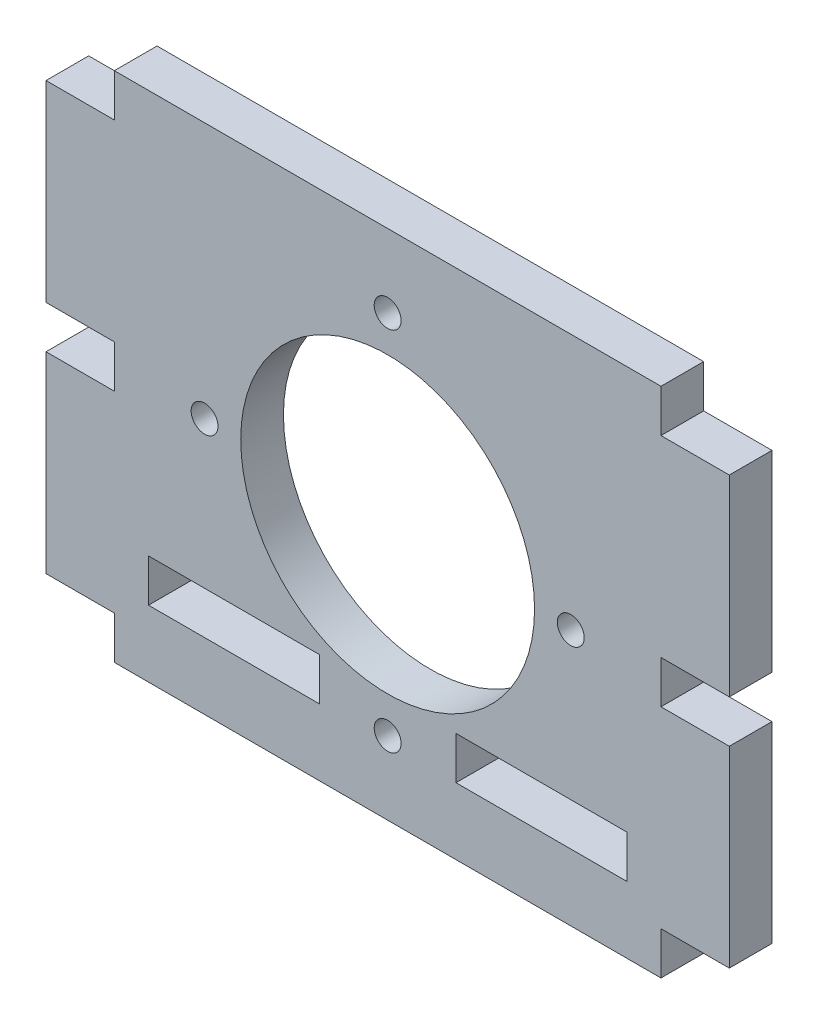
ISO-10303-21;
HEADER;
FILE_DESCRIPTION(('STEP AP214'),'2;1');
FILE_NAME('part.step','',(''),(''),'','','');
FILE_SCHEMA(('AUTOMOTIVE_DESIGN { 1 0 10303 214 1 1 1 1 }'));
ENDSEC;
DATA;
#1=APPLICATION_CONTEXT('core data for automotive mechanical design processes');
#2=APPLICATION_PROTOCOL_DEFINITION('international standard','automotive_design',2000,#1);
#3=PRODUCT_CONTEXT('',#1,'mechanical');
#4=PRODUCT('Part','Part','',(#3));
#5=PRODUCT_RELATED_PRODUCT_CATEGORY('part','',(#4));
#6=PRODUCT_DEFINITION_FORMATION('','',#4);
#7=PRODUCT_DEFINITION_CONTEXT('part definition',#1,'design');
#8=PRODUCT_DEFINITION('design','',#6,#7);
#9=PRODUCT_DEFINITION_SHAPE('','',#8);
#10=(LENGTH_UNIT() NAMED_UNIT(*) SI_UNIT(.MILLI.,.METRE.));
#11=(NAMED_UNIT(*) PLANE_ANGLE_UNIT() SI_UNIT($,.RADIAN.));
#12=(NAMED_UNIT(*) SI_UNIT($,.STERADIAN.) SOLID_ANGLE_UNIT());
#13=UNCERTAINTY_MEASURE_WITH_UNIT(LENGTH_MEASURE(1.E-05),#10,'distance_accuracy_value','');
#14=(GEOMETRIC_REPRESENTATION_CONTEXT(3) GLOBAL_UNCERTAINTY_ASSIGNED_CONTEXT((#13)) GLOBAL_UNIT_ASSIGNED_CONTEXT((#10,
#11,#12)) REPRESENTATION_CONTEXT('',''));
#15=CARTESIAN_POINT('',(0.,0.,0.));
#16=DIRECTION('',(0.,0.,1.));
#17=DIRECTION('',(1.,0.,0.));
#18=AXIS2_PLACEMENT_3D('',#15,#16,#17);
#19=CARTESIAN_POINT('',(-5.08000000000001,0.,3.175));
#20=DIRECTION('',(-1.,0.,0.));
#21=DIRECTION('',(0.,-1.,0.));
#22=AXIS2_PLACEMENT_3D('',#19,#20,#21);
#23=PLANE('',#22);
#24=DIRECTION('',(0.,1.,0.));
#25=VECTOR('',#24,1.);
#26=CARTESIAN_POINT('',(-5.08000000000001,0.,0.));
#27=LINE('',#26,#25);
#28=CARTESIAN_POINT('',(-5.08000000000001,-14.097,0.));
#29=VERTEX_POINT('',#28);
#30=CARTESIAN_POINT('',(-5.08000000000001,-10.922,0.));
#31=VERTEX_POINT('',#30);
#32=EDGE_CURVE('E407',#29,#31,#27,.T.);
#33=ORIENTED_EDGE('',*,*,#32,.F.);
#34=DIRECTION('',(0.,0.,-1.));
#35=VECTOR('',#34,1.);
#36=CARTESIAN_POINT('',(-5.08000000000001,-14.097,3.175));
#37=LINE('',#36,#35);
#38=CARTESIAN_POINT('',(-5.08000000000001,-14.097,3.175));
#39=VERTEX_POINT('',#38);
#40=EDGE_CURVE('E11',#39,#29,#37,.T.);
#41=ORIENTED_EDGE('',*,*,#40,.F.);
#42=DIRECTION('',(0.,1.,0.));
#43=VECTOR('',#42,1.);
#44=CARTESIAN_POINT('',(-5.08000000000001,0.,3.175));
#45=LINE('',#44,#43);
#46=CARTESIAN_POINT('',(-5.08000000000001,-10.922,3.175));
#47=VERTEX_POINT('',#46);
#48=EDGE_CURVE('E248',#39,#47,#45,.T.);
#49=ORIENTED_EDGE('',*,*,#48,.T.);
#50=DIRECTION('',(0.,0.,-1.));
#51=VECTOR('',#50,1.);
#52=CARTESIAN_POINT('',(-5.08000000000001,-10.922,3.175));
#53=LINE('',#52,#51);
#54=EDGE_CURVE('E61',#47,#31,#53,.T.);
#55=ORIENTED_EDGE('',*,*,#54,.T.);
#56=EDGE_LOOP('',(#33,#41,#49,#55));
#57=FACE_BOUND('',#56,.T.);
#58=ADVANCED_FACE('F41',(#57),#23,.T.);
#59=CARTESIAN_POINT('',(0.,-14.097,3.175));
#60=DIRECTION('',(0.,-1.,0.));
#61=DIRECTION('',(1.,0.,0.));
#62=AXIS2_PLACEMENT_3D('',#59,#60,#61);
#63=PLANE('',#62);
#64=DIRECTION('',(-1.,0.,0.));
#65=VECTOR('',#64,1.);
#66=CARTESIAN_POINT('',(0.,-14.097,0.));
#67=LINE('',#66,#65);
#68=CARTESIAN_POINT('',(-17.78,-14.097,0.));
#69=VERTEX_POINT('',#68);
#70=EDGE_CURVE('E254',#29,#69,#67,.T.);
#71=ORIENTED_EDGE('',*,*,#70,.T.);
#72=DIRECTION('',(0.,0.,-1.));
#73=VECTOR('',#72,1.);
#74=CARTESIAN_POINT('',(-17.78,-14.097,3.175));
#75=LINE('',#74,#73);
#76=CARTESIAN_POINT('',(-17.78,-14.097,3.175));
#77=VERTEX_POINT('',#76);
#78=EDGE_CURVE('E52',#77,#69,#75,.T.);
#79=ORIENTED_EDGE('',*,*,#78,.F.);
#80=DIRECTION('',(-1.,0.,0.));
#81=VECTOR('',#80,1.);
#82=CARTESIAN_POINT('',(0.,-14.097,3.175));
#83=LINE('',#82,#81);
#84=EDGE_CURVE('E243',#39,#77,#83,.T.);
#85=ORIENTED_EDGE('',*,*,#84,.F.);
#86=ORIENTED_EDGE('',*,*,#40,.T.);
#87=EDGE_LOOP('',(#71,#79,#85,#86));
#88=FACE_BOUND('',#87,.T.);
#89=ADVANCED_FACE('F252',(#88),#63,.F.);
#90=CARTESIAN_POINT('',(-17.78,0.,3.175));
#91=DIRECTION('',(-1.,0.,0.));
#92=DIRECTION('',(0.,0.,1.));
#93=AXIS2_PLACEMENT_3D('',#90,#91,#92);
#94=PLANE('',#93);
#95=DIRECTION('',(0.,1.,0.));
#96=VECTOR('',#95,1.);
#97=CARTESIAN_POINT('',(-17.78,0.,0.));
#98=LINE('',#97,#96);
#99=CARTESIAN_POINT('',(-17.78,-10.922,0.));
#100=VERTEX_POINT('',#99);
#101=EDGE_CURVE('E412',#69,#100,#98,.T.);
#102=ORIENTED_EDGE('',*,*,#101,.T.);
#103=DIRECTION('',(0.,0.,-1.));
#104=VECTOR('',#103,1.);
#105=CARTESIAN_POINT('',(-17.78,-10.922,3.175));
#106=LINE('',#105,#104);
#107=CARTESIAN_POINT('',(-17.78,-10.922,3.175));
#108=VERTEX_POINT('',#107);
#109=EDGE_CURVE('E147',#108,#100,#106,.T.);
#110=ORIENTED_EDGE('',*,*,#109,.F.);
#111=DIRECTION('',(0.,1.,0.));
#112=VECTOR('',#111,1.);
#113=CARTESIAN_POINT('',(-17.78,0.,3.175));
#114=LINE('',#113,#112);
#115=EDGE_CURVE('E234',#77,#108,#114,.T.);
#116=ORIENTED_EDGE('',*,*,#115,.F.);
#117=ORIENTED_EDGE('',*,*,#78,.T.);
#118=EDGE_LOOP('',(#102,#110,#116,#117));
#119=FACE_BOUND('',#118,.T.);
#120=ADVANCED_FACE('F236',(#119),#94,.F.);
#121=CARTESIAN_POINT('',(17.78,0.,3.175));
#122=DIRECTION('',(-1.,0.,0.));
#123=DIRECTION('',(0.,0.,1.));
#124=AXIS2_PLACEMENT_3D('',#121,#122,#123);
#125=PLANE('',#124);
#126=DIRECTION('',(0.,1.,0.));
#127=VECTOR('',#126,1.);
#128=CARTESIAN_POINT('',(17.78,0.,0.));
#129=LINE('',#128,#127);
#130=CARTESIAN_POINT('',(17.78,-14.097,0.));
#131=VERTEX_POINT('',#130);
#132=CARTESIAN_POINT('',(17.78,-10.922,0.));
#133=VERTEX_POINT('',#132);
#134=EDGE_CURVE('E391',#131,#133,#129,.T.);
#135=ORIENTED_EDGE('',*,*,#134,.F.);
#136=DIRECTION('',(0.,0.,-1.));
#137=VECTOR('',#136,1.);
#138=CARTESIAN_POINT('',(17.78,-14.097,3.175));
#139=LINE('',#138,#137);
#140=CARTESIAN_POINT('',(17.78,-14.097,3.175));
#141=VERTEX_POINT('',#140);
#142=EDGE_CURVE('E271',#141,#131,#139,.T.);
#143=ORIENTED_EDGE('',*,*,#142,.F.);
#144=DIRECTION('',(0.,1.,0.));
#145=VECTOR('',#144,1.);
#146=CARTESIAN_POINT('',(17.78,0.,3.175));
#147=LINE('',#146,#145);
#148=CARTESIAN_POINT('',(17.78,-10.922,3.175));
#149=VERTEX_POINT('',#148);
#150=EDGE_CURVE('E510',#141,#149,#147,.T.);
#151=ORIENTED_EDGE('',*,*,#150,.T.);
#152=DIRECTION('',(0.,0.,-1.));
#153=VECTOR('',#152,1.);
#154=CARTESIAN_POINT('',(17.78,-10.922,3.175));
#155=LINE('',#154,#153);
#156=EDGE_CURVE('E261',#149,#133,#155,.T.);
#157=ORIENTED_EDGE('',*,*,#156,.T.);
#158=EDGE_LOOP('',(#135,#143,#151,#157));
#159=FACE_BOUND('',#158,.T.);
#160=ADVANCED_FACE('F586',(#159),#125,.T.);
#161=CARTESIAN_POINT('',(0.,-14.097,3.175));
#162=DIRECTION('',(0.,1.,0.));
#163=DIRECTION('',(0.,0.,1.));
#164=AXIS2_PLACEMENT_3D('',#161,#162,#163);
#165=PLANE('',#164);
#166=DIRECTION('',(1.,0.,0.));
#167=VECTOR('',#166,1.);
#168=CARTESIAN_POINT('',(0.,-14.097,0.));
#169=LINE('',#168,#167);
#170=CARTESIAN_POINT('',(5.08000000000002,-14.097,0.));
#171=VERTEX_POINT('',#170);
#172=EDGE_CURVE('E395',#171,#131,#169,.T.);
#173=ORIENTED_EDGE('',*,*,#172,.F.);
#174=DIRECTION('',(0.,0.,-1.));
#175=VECTOR('',#174,1.);
#176=CARTESIAN_POINT('',(5.08000000000002,-14.097,3.175));
#177=LINE('',#176,#175);
#178=CARTESIAN_POINT('',(5.08000000000002,-14.097,3.175));
#179=VERTEX_POINT('',#178);
#180=EDGE_CURVE('E268',#179,#171,#177,.T.);
#181=ORIENTED_EDGE('',*,*,#180,.F.);
#182=DIRECTION('',(1.,0.,0.));
#183=VECTOR('',#182,1.);
#184=CARTESIAN_POINT('',(0.,-14.097,3.175));
#185=LINE('',#184,#183);
#186=EDGE_CURVE('E514',#179,#141,#185,.T.);
#187=ORIENTED_EDGE('',*,*,#186,.T.);
#188=ORIENTED_EDGE('',*,*,#142,.T.);
#189=EDGE_LOOP('',(#173,#181,#187,#188));
#190=FACE_BOUND('',#189,.T.);
#191=ADVANCED_FACE('F582',(#190),#165,.T.);
#192=CARTESIAN_POINT('',(5.08000000000002,0.,3.175));
#193=DIRECTION('',(-1.,0.,0.));
#194=DIRECTION('',(0.,0.,1.));
#195=AXIS2_PLACEMENT_3D('',#192,#193,#194);
#196=PLANE('',#195);
#197=DIRECTION('',(0.,1.,0.));
#198=VECTOR('',#197,1.);
#199=CARTESIAN_POINT('',(5.08000000000002,0.,0.));
#200=LINE('',#199,#198);
#201=CARTESIAN_POINT('',(5.08000000000002,-10.922,0.));
#202=VERTEX_POINT('',#201);
#203=EDGE_CURVE('E399',#171,#202,#200,.T.);
#204=ORIENTED_EDGE('',*,*,#203,.T.);
#205=DIRECTION('',(0.,0.,-1.));
#206=VECTOR('',#205,1.);
#207=CARTESIAN_POINT('',(5.08000000000002,-10.922,3.175));
#208=LINE('',#207,#206);
#209=CARTESIAN_POINT('',(5.08000000000002,-10.922,3.175));
#210=VERTEX_POINT('',#209);
#211=EDGE_CURVE('E264',#210,#202,#208,.T.);
#212=ORIENTED_EDGE('',*,*,#211,.F.);
#213=DIRECTION('',(0.,1.,0.));
#214=VECTOR('',#213,1.);
#215=CARTESIAN_POINT('',(5.08000000000002,0.,3.175));
#216=LINE('',#215,#214);
#217=EDGE_CURVE('E518',#179,#210,#216,.T.);
#218=ORIENTED_EDGE('',*,*,#217,.F.);
#219=ORIENTED_EDGE('',*,*,#180,.T.);
#220=EDGE_LOOP('',(#204,#212,#218,#219));
#221=FACE_BOUND('',#220,.T.);
#222=ADVANCED_FACE('F579',(#221),#196,.F.);
#223=CARTESIAN_POINT('',(0.,-1.58750000000001,3.175));
#224=DIRECTION('',(0.,1.,0.));
#225=DIRECTION('',(-1.,0.,0.));
#226=AXIS2_PLACEMENT_3D('',#223,#224,#225);
#227=PLANE('',#226);
#228=DIRECTION('',(1.,0.,0.));
#229=VECTOR('',#228,1.);
#230=CARTESIAN_POINT('',(0.,-1.58750000000001,0.));
#231=LINE('',#230,#229);
#232=CARTESIAN_POINT('',(-25.4,-1.58750000000001,0.));
#233=VERTEX_POINT('',#232);
#234=CARTESIAN_POINT('',(-20.3200000000001,-1.58750000000001,0.));
#235=VERTEX_POINT('',#234);
#236=EDGE_CURVE('E349',#233,#235,#231,.T.);
#237=ORIENTED_EDGE('',*,*,#236,.F.);
#238=DIRECTION('',(0.,0.,-1.));
#239=VECTOR('',#238,1.);
#240=CARTESIAN_POINT('',(-25.4,-1.58750000000001,3.175));
#241=LINE('',#240,#239);
#242=CARTESIAN_POINT('',(-25.4,-1.58750000000001,3.175));
#243=VERTEX_POINT('',#242);
#244=EDGE_CURVE('E45',#243,#233,#241,.T.);
#245=ORIENTED_EDGE('',*,*,#244,.F.);
#246=DIRECTION('',(1.,0.,0.));
#247=VECTOR('',#246,1.);
#248=CARTESIAN_POINT('',(0.,-1.58750000000001,3.175));
#249=LINE('',#248,#247);
#250=CARTESIAN_POINT('',(-20.3200000000001,-1.58750000000001,3.175));
#251=VERTEX_POINT('',#250);
#252=EDGE_CURVE('E443',#243,#251,#249,.T.);
#253=ORIENTED_EDGE('',*,*,#252,.T.);
#254=DIRECTION('',(0.,0.,-1.));
#255=VECTOR('',#254,1.);
#256=CARTESIAN_POINT('',(-20.3200000000001,-1.58750000000001,3.175));
#257=LINE('',#256,#255);
#258=EDGE_CURVE('E274',#251,#235,#257,.T.);
#259=ORIENTED_EDGE('',*,*,#258,.T.);
#260=EDGE_LOOP('',(#237,#245,#253,#259));
#261=FACE_BOUND('',#260,.T.);
#262=ADVANCED_FACE('F350',(#261),#227,.T.);
#263=CARTESIAN_POINT('',(-25.4,0.,3.175));
#264=DIRECTION('',(-1.,0.,0.));
#265=DIRECTION('',(0.,0.,1.));
#266=AXIS2_PLACEMENT_3D('',#263,#264,#265);
#267=PLANE('',#266);
#268=DIRECTION('',(0.,1.,0.));
#269=VECTOR('',#268,1.);
#270=CARTESIAN_POINT('',(-25.4,0.,0.));
#271=LINE('',#270,#269);
#272=CARTESIAN_POINT('',(-25.4,-15.875,0.));
#273=VERTEX_POINT('',#272);
#274=EDGE_CURVE('E344',#273,#233,#271,.T.);
#275=ORIENTED_EDGE('',*,*,#274,.F.);
#276=DIRECTION('',(0.,0.,-1.));
#277=VECTOR('',#276,1.);
#278=CARTESIAN_POINT('',(-25.4,-15.875,3.175));
#279=LINE('',#278,#277);
#280=CARTESIAN_POINT('',(-25.4,-15.875,3.175));
#281=VERTEX_POINT('',#280);
#282=EDGE_CURVE('E333',#281,#273,#279,.T.);
#283=ORIENTED_EDGE('',*,*,#282,.F.);
#284=DIRECTION('',(0.,1.,0.));
#285=VECTOR('',#284,1.);
#286=CARTESIAN_POINT('',(-25.4,0.,3.175));
#287=LINE('',#286,#285);
#288=EDGE_CURVE('E347',#281,#243,#287,.T.);
#289=ORIENTED_EDGE('',*,*,#288,.T.);
#290=ORIENTED_EDGE('',*,*,#244,.T.);
#291=EDGE_LOOP('',(#275,#283,#289,#290));
#292=FACE_BOUND('',#291,.T.);
#293=ADVANCED_FACE('F342',(#292),#267,.T.);
#294=CARTESIAN_POINT('',(0.,-15.875,3.175));
#295=DIRECTION('',(0.,-1.,0.));
#296=DIRECTION('',(1.,0.,0.));
#297=AXIS2_PLACEMENT_3D('',#294,#295,#296);
#298=PLANE('',#297);
#299=DIRECTION('',(-1.,0.,0.));
#300=VECTOR('',#299,1.);
#301=CARTESIAN_POINT('',(0.,-15.875,0.));
#302=LINE('',#301,#300);
#303=CARTESIAN_POINT('',(-20.3200000000001,-15.875,0.));
#304=VERTEX_POINT('',#303);
#305=EDGE_CURVE('E360',#304,#273,#302,.T.);
#306=ORIENTED_EDGE('',*,*,#305,.F.);
#307=DIRECTION('',(0.,0.,-1.));
#308=VECTOR('',#307,1.);
#309=CARTESIAN_POINT('',(-20.3200000000001,-15.875,3.175));
#310=LINE('',#309,#308);
#311=CARTESIAN_POINT('',(-20.3200000000001,-15.875,3.175));
#312=VERTEX_POINT('',#311);
#313=EDGE_CURVE('E331',#312,#304,#310,.T.);
#314=ORIENTED_EDGE('',*,*,#313,.F.);
#315=DIRECTION('',(-1.,0.,0.));
#316=VECTOR('',#315,1.);
#317=CARTESIAN_POINT('',(0.,-15.875,3.175));
#318=LINE('',#317,#316);
#319=EDGE_CURVE('E448',#312,#281,#318,.T.);
#320=ORIENTED_EDGE('',*,*,#319,.T.);
#321=ORIENTED_EDGE('',*,*,#282,.T.);
#322=EDGE_LOOP('',(#306,#314,#320,#321));
#323=FACE_BOUND('',#322,.T.);
#324=ADVANCED_FACE('F649',(#323),#298,.T.);
#325=CARTESIAN_POINT('',(-20.3200000000001,0.,3.175));
#326=DIRECTION('',(-1.,0.,0.));
#327=DIRECTION('',(0.,0.,1.));
#328=AXIS2_PLACEMENT_3D('',#325,#326,#327);
#329=PLANE('',#328);
#330=DIRECTION('',(0.,1.,0.));
#331=VECTOR('',#330,1.);
#332=CARTESIAN_POINT('',(-20.3200000000001,0.,0.));
#333=LINE('',#332,#331);
#334=CARTESIAN_POINT('',(-20.3200000000001,-19.05,0.));
#335=VERTEX_POINT('',#334);
#336=EDGE_CURVE('E365',#335,#304,#333,.T.);
#337=ORIENTED_EDGE('',*,*,#336,.F.);
#338=DIRECTION('',(0.,0.,-1.));
#339=VECTOR('',#338,1.);
#340=CARTESIAN_POINT('',(-20.3200000000001,-19.05,3.175));
#341=LINE('',#340,#339);
#342=CARTESIAN_POINT('',(-20.3200000000001,-19.05,3.175));
#343=VERTEX_POINT('',#342);
#344=EDGE_CURVE('E328',#343,#335,#341,.T.);
#345=ORIENTED_EDGE('',*,*,#344,.F.);
#346=DIRECTION('',(0.,1.,0.));
#347=VECTOR('',#346,1.);
#348=CARTESIAN_POINT('',(-20.3200000000001,0.,3.175));
#349=LINE('',#348,#347);
#350=EDGE_CURVE('E452',#343,#312,#349,.T.);
#351=ORIENTED_EDGE('',*,*,#350,.T.);
#352=ORIENTED_EDGE('',*,*,#313,.T.);
#353=EDGE_LOOP('',(#337,#345,#351,#352));
#354=FACE_BOUND('',#353,.T.);
#355=ADVANCED_FACE('F645',(#354),#329,.T.);
#356=CARTESIAN_POINT('',(0.,-19.05,3.175));
#357=DIRECTION('',(0.,1.,0.));
#358=DIRECTION('',(-1.,0.,0.));
#359=AXIS2_PLACEMENT_3D('',#356,#357,#358);
#360=PLANE('',#359);
#361=DIRECTION('',(1.,0.,0.));
#362=VECTOR('',#361,1.);
#363=CARTESIAN_POINT('',(0.,-19.05,0.));
#364=LINE('',#363,#362);
#365=CARTESIAN_POINT('',(20.3200000000001,-19.05,0.));
#366=VERTEX_POINT('',#365);
#367=EDGE_CURVE('E957',#335,#366,#364,.T.);
#368=ORIENTED_EDGE('',*,*,#367,.T.);
#369=DIRECTION('',(0.,0.,-1.));
#370=VECTOR('',#369,1.);
#371=CARTESIAN_POINT('',(20.3200000000001,-19.05,3.175));
#372=LINE('',#371,#370);
#373=CARTESIAN_POINT('',(20.3200000000001,-19.05,3.175));
#374=VERTEX_POINT('',#373);
#375=EDGE_CURVE('E324',#374,#366,#372,.T.);
#376=ORIENTED_EDGE('',*,*,#375,.F.);
#377=DIRECTION('',(1.,0.,0.));
#378=VECTOR('',#377,1.);
#379=CARTESIAN_POINT('',(0.,-19.05,3.175));
#380=LINE('',#379,#378);
#381=EDGE_CURVE('E456',#343,#374,#380,.T.);
#382=ORIENTED_EDGE('',*,*,#381,.F.);
#383=ORIENTED_EDGE('',*,*,#344,.T.);
#384=EDGE_LOOP('',(#368,#376,#382,#383));
#385=FACE_BOUND('',#384,.T.);
#386=ADVANCED_FACE('F641',(#385),#360,.F.);
#387=CARTESIAN_POINT('',(20.32,0.,3.175));
#388=DIRECTION('',(-1.,0.,0.));
#389=DIRECTION('',(0.,-1.,0.));
#390=AXIS2_PLACEMENT_3D('',#387,#388,#389);
#391=PLANE('',#390);
#392=DIRECTION('',(0.,1.,0.));
#393=VECTOR('',#392,1.);
#394=CARTESIAN_POINT('',(20.32,0.,0.));
#395=LINE('',#394,#393);
#396=CARTESIAN_POINT('',(20.3200000000001,-15.875,0.));
#397=VERTEX_POINT('',#396);
#398=EDGE_CURVE('E953',#366,#397,#395,.T.);
#399=ORIENTED_EDGE('',*,*,#398,.T.);
#400=DIRECTION('',(0.,0.,-1.));
#401=VECTOR('',#400,1.);
#402=CARTESIAN_POINT('',(20.3200000000001,-15.875,3.175));
#403=LINE('',#402,#401);
#404=CARTESIAN_POINT('',(20.3200000000001,-15.875,3.175));
#405=VERTEX_POINT('',#404);
#406=EDGE_CURVE('E320',#405,#397,#403,.T.);
#407=ORIENTED_EDGE('',*,*,#406,.F.);
#408=DIRECTION('',(0.,1.,0.));
#409=VECTOR('',#408,1.);
#410=CARTESIAN_POINT('',(20.32,0.,3.175));
#411=LINE('',#410,#409);
#412=EDGE_CURVE('E460',#374,#405,#411,.T.);
#413=ORIENTED_EDGE('',*,*,#412,.F.);
#414=ORIENTED_EDGE('',*,*,#375,.T.);
#415=EDGE_LOOP('',(#399,#407,#413,#414));
#416=FACE_BOUND('',#415,.T.);
#417=ADVANCED_FACE('F637',(#416),#391,.F.);
#418=CARTESIAN_POINT('',(0.,-15.875,3.175));
#419=DIRECTION('',(0.,1.,0.));
#420=DIRECTION('',(-1.,0.,0.));
#421=AXIS2_PLACEMENT_3D('',#418,#419,#420);
#422=PLANE('',#421);
#423=DIRECTION('',(1.,0.,0.));
#424=VECTOR('',#423,1.);
#425=CARTESIAN_POINT('',(0.,-15.875,0.));
#426=LINE('',#425,#424);
#427=CARTESIAN_POINT('',(25.4,-15.875,0.));
#428=VERTEX_POINT('',#427);
#429=EDGE_CURVE('E949',#397,#428,#426,.T.);
#430=ORIENTED_EDGE('',*,*,#429,.T.);
#431=DIRECTION('',(0.,0.,-1.));
#432=VECTOR('',#431,1.);
#433=CARTESIAN_POINT('',(25.4,-15.875,3.175));
#434=LINE('',#433,#432);
#435=CARTESIAN_POINT('',(25.4,-15.875,3.175));
#436=VERTEX_POINT('',#435);
#437=EDGE_CURVE('E316',#436,#428,#434,.T.);
#438=ORIENTED_EDGE('',*,*,#437,.F.);
#439=DIRECTION('',(1.,0.,0.));
#440=VECTOR('',#439,1.);
#441=CARTESIAN_POINT('',(0.,-15.875,3.175));
#442=LINE('',#441,#440);
#443=EDGE_CURVE('E464',#405,#436,#442,.T.);
#444=ORIENTED_EDGE('',*,*,#443,.F.);
#445=ORIENTED_EDGE('',*,*,#406,.T.);
#446=EDGE_LOOP('',(#430,#438,#444,#445));
#447=FACE_BOUND('',#446,.T.);
#448=ADVANCED_FACE('F634',(#447),#422,.F.);
#449=CARTESIAN_POINT('',(25.4,0.,3.175));
#450=DIRECTION('',(-1.,0.,0.));
#451=DIRECTION('',(0.,-1.,0.));
#452=AXIS2_PLACEMENT_3D('',#449,#450,#451);
#453=PLANE('',#452);
#454=DIRECTION('',(0.,1.,0.));
#455=VECTOR('',#454,1.);
#456=CARTESIAN_POINT('',(25.4,0.,0.));
#457=LINE('',#456,#455);
#458=CARTESIAN_POINT('',(25.4,-1.5875,0.));
#459=VERTEX_POINT('',#458);
#460=EDGE_CURVE('E945',#428,#459,#457,.T.);
#461=ORIENTED_EDGE('',*,*,#460,.T.);
#462=DIRECTION('',(0.,0.,-1.));
#463=VECTOR('',#462,1.);
#464=CARTESIAN_POINT('',(25.4,-1.5875,3.175));
#465=LINE('',#464,#463);
#466=CARTESIAN_POINT('',(25.4,-1.5875,3.175));
#467=VERTEX_POINT('',#466);
#468=EDGE_CURVE('E312',#467,#459,#465,.T.);
#469=ORIENTED_EDGE('',*,*,#468,.F.);
#470=DIRECTION('',(0.,1.,0.));
#471=VECTOR('',#470,1.);
#472=CARTESIAN_POINT('',(25.4,0.,3.175));
#473=LINE('',#472,#471);
#474=EDGE_CURVE('E468',#436,#467,#473,.T.);
#475=ORIENTED_EDGE('',*,*,#474,.F.);
#476=ORIENTED_EDGE('',*,*,#437,.T.);
#477=EDGE_LOOP('',(#461,#469,#475,#476));
#478=FACE_BOUND('',#477,.T.);
#479=ADVANCED_FACE('F622',(#478),#453,.F.);
#480=CARTESIAN_POINT('',(0.,-1.5875,3.175));
#481=DIRECTION('',(0.,-1.,0.));
#482=DIRECTION('',(1.,0.,0.));
#483=AXIS2_PLACEMENT_3D('',#480,#481,#482);
#484=PLANE('',#483);
#485=DIRECTION('',(-1.,0.,0.));
#486=VECTOR('',#485,1.);
#487=CARTESIAN_POINT('',(0.,-1.5875,0.));
#488=LINE('',#487,#486);
#489=CARTESIAN_POINT('',(20.3200000000001,-1.5875,0.));
#490=VERTEX_POINT('',#489);
#491=EDGE_CURVE('E941',#459,#490,#488,.T.);
#492=ORIENTED_EDGE('',*,*,#491,.T.);
#493=DIRECTION('',(0.,0.,-1.));
#494=VECTOR('',#493,1.);
#495=CARTESIAN_POINT('',(20.3200000000001,-1.5875,3.175));
#496=LINE('',#495,#494);
#497=CARTESIAN_POINT('',(20.3200000000001,-1.5875,3.175));
#498=VERTEX_POINT('',#497);
#499=EDGE_CURVE('E308',#498,#490,#496,.T.);
#500=ORIENTED_EDGE('',*,*,#499,.F.);
#501=DIRECTION('',(-1.,0.,0.));
#502=VECTOR('',#501,1.);
#503=CARTESIAN_POINT('',(0.,-1.5875,3.175));
#504=LINE('',#503,#502);
#505=EDGE_CURVE('E472',#467,#498,#504,.T.);
#506=ORIENTED_EDGE('',*,*,#505,.F.);
#507=ORIENTED_EDGE('',*,*,#468,.T.);
#508=EDGE_LOOP('',(#492,#500,#506,#507));
#509=FACE_BOUND('',#508,.T.);
#510=ADVANCED_FACE('F629',(#509),#484,.F.);
#511=CARTESIAN_POINT('',(20.3200000000001,0.,3.175));
#512=DIRECTION('',(-1.,0.,0.));
#513=DIRECTION('',(0.,0.,1.));
#514=AXIS2_PLACEMENT_3D('',#511,#512,#513);
#515=PLANE('',#514);
#516=DIRECTION('',(0.,1.,0.));
#517=VECTOR('',#516,1.);
#518=CARTESIAN_POINT('',(20.3200000000001,0.,0.));
#519=LINE('',#518,#517);
#520=CARTESIAN_POINT('',(20.3200000000001,1.5875,0.));
#521=VERTEX_POINT('',#520);
#522=EDGE_CURVE('E937',#490,#521,#519,.T.);
#523=ORIENTED_EDGE('',*,*,#522,.T.);
#524=DIRECTION('',(0.,0.,-1.));
#525=VECTOR('',#524,1.);
#526=CARTESIAN_POINT('',(20.3200000000001,1.5875,3.175));
#527=LINE('',#526,#525);
#528=CARTESIAN_POINT('',(20.3200000000001,1.5875,3.175));
#529=VERTEX_POINT('',#528);
#530=EDGE_CURVE('E305',#529,#521,#527,.T.);
#531=ORIENTED_EDGE('',*,*,#530,.F.);
#532=DIRECTION('',(0.,1.,0.));
#533=VECTOR('',#532,1.);
#534=CARTESIAN_POINT('',(20.3200000000001,0.,3.175));
#535=LINE('',#534,#533);
#536=EDGE_CURVE('E477',#498,#529,#535,.T.);
#537=ORIENTED_EDGE('',*,*,#536,.F.);
#538=ORIENTED_EDGE('',*,*,#499,.T.);
#539=EDGE_LOOP('',(#523,#531,#537,#538));
#540=FACE_BOUND('',#539,.T.);
#541=ADVANCED_FACE('F625',(#540),#515,.F.);
#542=CARTESIAN_POINT('',(0.,1.5875,3.175));
#543=DIRECTION('',(0.,-1.,0.));
#544=DIRECTION('',(1.,0.,0.));
#545=AXIS2_PLACEMENT_3D('',#542,#543,#544);
#546=PLANE('',#545);
#547=DIRECTION('',(-1.,0.,0.));
#548=VECTOR('',#547,1.);
#549=CARTESIAN_POINT('',(0.,1.5875,0.));
#550=LINE('',#549,#548);
#551=CARTESIAN_POINT('',(25.4,1.5875,0.));
#552=VERTEX_POINT('',#551);
#553=EDGE_CURVE('E933',#552,#521,#550,.T.);
#554=ORIENTED_EDGE('',*,*,#553,.F.);
#555=DIRECTION('',(0.,0.,-1.));
#556=VECTOR('',#555,1.);
#557=CARTESIAN_POINT('',(25.4,1.5875,3.175));
#558=LINE('',#557,#556);
#559=CARTESIAN_POINT('',(25.4,1.5875,3.175));
#560=VERTEX_POINT('',#559);
#561=EDGE_CURVE('E302',#560,#552,#558,.T.);
#562=ORIENTED_EDGE('',*,*,#561,.F.);
#563=DIRECTION('',(-1.,0.,0.));
#564=VECTOR('',#563,1.);
#565=CARTESIAN_POINT('',(0.,1.5875,3.175));
#566=LINE('',#565,#564);
#567=EDGE_CURVE('E480',#560,#529,#566,.T.);
#568=ORIENTED_EDGE('',*,*,#567,.T.);
#569=ORIENTED_EDGE('',*,*,#530,.T.);
#570=EDGE_LOOP('',(#554,#562,#568,#569));
#571=FACE_BOUND('',#570,.T.);
#572=ADVANCED_FACE('F620',(#571),#546,.T.);
#573=CARTESIAN_POINT('',(25.4,15.875,0.));
#574=VERTEX_POINT('',#573);
#575=EDGE_CURVE('E932',#552,#574,#457,.T.);
#576=ORIENTED_EDGE('',*,*,#575,.T.);
#577=DIRECTION('',(0.,0.,-1.));
#578=VECTOR('',#577,1.);
#579=CARTESIAN_POINT('',(25.4,15.875,3.175));
#580=LINE('',#579,#578);
#581=CARTESIAN_POINT('',(25.4,15.875,3.175));
#582=VERTEX_POINT('',#581);
#583=EDGE_CURVE('E299',#582,#574,#580,.T.);
#584=ORIENTED_EDGE('',*,*,#583,.F.);
#585=EDGE_CURVE('E473',#560,#582,#473,.T.);
#586=ORIENTED_EDGE('',*,*,#585,.F.);
#587=ORIENTED_EDGE('',*,*,#561,.T.);
#588=EDGE_LOOP('',(#576,#584,#586,#587));
#589=FACE_BOUND('',#588,.T.);
#590=ADVANCED_FACE('F616',(#589),#453,.F.);
#591=CARTESIAN_POINT('',(0.,15.875,3.175));
#592=DIRECTION('',(0.,1.,0.));
#593=DIRECTION('',(-1.,0.,0.));
#594=AXIS2_PLACEMENT_3D('',#591,#592,#593);
#595=PLANE('',#594);
#596=DIRECTION('',(1.,0.,0.));
#597=VECTOR('',#596,1.);
#598=CARTESIAN_POINT('',(0.,15.875,0.));
#599=LINE('',#598,#597);
#600=CARTESIAN_POINT('',(20.3200000000001,15.875,0.));
#601=VERTEX_POINT('',#600);
#602=EDGE_CURVE('E926',#601,#574,#599,.T.);
#603=ORIENTED_EDGE('',*,*,#602,.F.);
#604=DIRECTION('',(0.,0.,-1.));
#605=VECTOR('',#604,1.);
#606=CARTESIAN_POINT('',(20.3200000000001,15.875,3.175));
#607=LINE('',#606,#605);
#608=CARTESIAN_POINT('',(20.3200000000001,15.875,3.175));
#609=VERTEX_POINT('',#608);
#610=EDGE_CURVE('E296',#609,#601,#607,.T.);
#611=ORIENTED_EDGE('',*,*,#610,.F.);
#612=DIRECTION('',(1.,0.,0.));
#613=VECTOR('',#612,1.);
#614=CARTESIAN_POINT('',(0.,15.875,3.175));
#615=LINE('',#614,#613);
#616=EDGE_CURVE('E484',#609,#582,#615,.T.);
#617=ORIENTED_EDGE('',*,*,#616,.T.);
#618=ORIENTED_EDGE('',*,*,#583,.T.);
#619=EDGE_LOOP('',(#603,#611,#617,#618));
#620=FACE_BOUND('',#619,.T.);
#621=ADVANCED_FACE('F612',(#620),#595,.T.);
#622=CARTESIAN_POINT('',(20.3200000000001,0.,3.175));
#623=DIRECTION('',(1.,0.,0.));
#624=DIRECTION('',(0.,0.,-1.));
#625=AXIS2_PLACEMENT_3D('',#622,#623,#624);
#626=PLANE('',#625);
#627=DIRECTION('',(0.,-1.,0.));
#628=VECTOR('',#627,1.);
#629=CARTESIAN_POINT('',(20.3200000000001,0.,0.));
#630=LINE('',#629,#628);
#631=CARTESIAN_POINT('',(20.3200000000001,19.05,0.));
#632=VERTEX_POINT('',#631);
#633=EDGE_CURVE('E924',#632,#601,#630,.T.);
#634=ORIENTED_EDGE('',*,*,#633,.F.);
#635=DIRECTION('',(0.,0.,-1.));
#636=VECTOR('',#635,1.);
#637=CARTESIAN_POINT('',(20.3200000000001,19.05,3.175));
#638=LINE('',#637,#636);
#639=CARTESIAN_POINT('',(20.3200000000001,19.05,3.175));
#640=VERTEX_POINT('',#639);
#641=EDGE_CURVE('E293',#640,#632,#638,.T.);
#642=ORIENTED_EDGE('',*,*,#641,.F.);
#643=DIRECTION('',(0.,-1.,0.));
#644=VECTOR('',#643,1.);
#645=CARTESIAN_POINT('',(20.3200000000001,0.,3.175));
#646=LINE('',#645,#644);
#647=EDGE_CURVE('E488',#640,#609,#646,.T.);
#648=ORIENTED_EDGE('',*,*,#647,.T.);
#649=ORIENTED_EDGE('',*,*,#610,.T.);
#650=EDGE_LOOP('',(#634,#642,#648,#649));
#651=FACE_BOUND('',#650,.T.);
#652=ADVANCED_FACE('F608',(#651),#626,.T.);
#653=CARTESIAN_POINT('',(0.,19.05,3.175));
#654=DIRECTION('',(0.,1.,0.));
#655=DIRECTION('',(-1.,0.,0.));
#656=AXIS2_PLACEMENT_3D('',#653,#654,#655);
#657=PLANE('',#656);
#658=DIRECTION('',(1.,0.,0.));
#659=VECTOR('',#658,1.);
#660=CARTESIAN_POINT('',(0.,19.05,0.));
#661=LINE('',#660,#659);
#662=CARTESIAN_POINT('',(-20.3200000000001,19.05,0.));
#663=VERTEX_POINT('',#662);
#664=EDGE_CURVE('E385',#663,#632,#661,.T.);
#665=ORIENTED_EDGE('',*,*,#664,.F.);
#666=DIRECTION('',(0.,0.,-1.));
#667=VECTOR('',#666,1.);
#668=CARTESIAN_POINT('',(-20.3200000000001,19.05,3.175));
#669=LINE('',#668,#667);
#670=CARTESIAN_POINT('',(-20.3200000000001,19.05,3.175));
#671=VERTEX_POINT('',#670);
#672=EDGE_CURVE('E290',#671,#663,#669,.T.);
#673=ORIENTED_EDGE('',*,*,#672,.F.);
#674=DIRECTION('',(1.,0.,0.));
#675=VECTOR('',#674,1.);
#676=CARTESIAN_POINT('',(0.,19.05,3.175));
#677=LINE('',#676,#675);
#678=EDGE_CURVE('E492',#671,#640,#677,.T.);
#679=ORIENTED_EDGE('',*,*,#678,.T.);
#680=ORIENTED_EDGE('',*,*,#641,.T.);
#681=EDGE_LOOP('',(#665,#673,#679,#680));
#682=FACE_BOUND('',#681,.T.);
#683=ADVANCED_FACE('F604',(#682),#657,.T.);
#684=CARTESIAN_POINT('',(-20.3200000000001,0.,3.175));
#685=DIRECTION('',(1.,0.,0.));
#686=DIRECTION('',(0.,0.,-1.));
#687=AXIS2_PLACEMENT_3D('',#684,#685,#686);
#688=PLANE('',#687);
#689=DIRECTION('',(0.,-1.,0.));
#690=VECTOR('',#689,1.);
#691=CARTESIAN_POINT('',(-20.3200000000001,0.,0.));
#692=LINE('',#691,#690);
#693=CARTESIAN_POINT('',(-20.3200000000001,15.875,0.));
#694=VERTEX_POINT('',#693);
#695=EDGE_CURVE('E379',#663,#694,#692,.T.);
#696=ORIENTED_EDGE('',*,*,#695,.T.);
#697=DIRECTION('',(0.,0.,-1.));
#698=VECTOR('',#697,1.);
#699=CARTESIAN_POINT('',(-20.3200000000001,15.875,3.175));
#700=LINE('',#699,#698);
#701=CARTESIAN_POINT('',(-20.3200000000001,15.875,3.175));
#702=VERTEX_POINT('',#701);
#703=EDGE_CURVE('E286',#702,#694,#700,.T.);
#704=ORIENTED_EDGE('',*,*,#703,.F.);
#705=DIRECTION('',(0.,-1.,0.));
#706=VECTOR('',#705,1.);
#707=CARTESIAN_POINT('',(-20.3200000000001,0.,3.175));
#708=LINE('',#707,#706);
#709=EDGE_CURVE('E496',#671,#702,#708,.T.);
#710=ORIENTED_EDGE('',*,*,#709,.F.);
#711=ORIENTED_EDGE('',*,*,#672,.T.);
#712=EDGE_LOOP('',(#696,#704,#710,#711));
#713=FACE_BOUND('',#712,.T.);
#714=ADVANCED_FACE('F601',(#713),#688,.F.);
#715=CARTESIAN_POINT('',(0.,15.875,3.175));
#716=DIRECTION('',(0.,-1.,0.));
#717=DIRECTION('',(1.,0.,0.));
#718=AXIS2_PLACEMENT_3D('',#715,#716,#717);
#719=PLANE('',#718);
#720=DIRECTION('',(-1.,0.,0.));
#721=VECTOR('',#720,1.);
#722=CARTESIAN_POINT('',(0.,15.875,0.));
#723=LINE('',#722,#721);
#724=CARTESIAN_POINT('',(-25.4,15.875,0.));
#725=VERTEX_POINT('',#724);
#726=EDGE_CURVE('E370',#694,#725,#723,.T.);
#727=ORIENTED_EDGE('',*,*,#726,.T.);
#728=DIRECTION('',(0.,0.,-1.));
#729=VECTOR('',#728,1.);
#730=CARTESIAN_POINT('',(-25.4,15.875,3.175));
#731=LINE('',#730,#729);
#732=CARTESIAN_POINT('',(-25.4,15.875,3.175));
#733=VERTEX_POINT('',#732);
#734=EDGE_CURVE('E283',#733,#725,#731,.T.);
#735=ORIENTED_EDGE('',*,*,#734,.F.);
#736=DIRECTION('',(-1.,0.,0.));
#737=VECTOR('',#736,1.);
#738=CARTESIAN_POINT('',(0.,15.875,3.175));
#739=LINE('',#738,#737);
#740=EDGE_CURVE('E500',#702,#733,#739,.T.);
#741=ORIENTED_EDGE('',*,*,#740,.F.);
#742=ORIENTED_EDGE('',*,*,#703,.T.);
#743=EDGE_LOOP('',(#727,#735,#741,#742));
#744=FACE_BOUND('',#743,.T.);
#745=ADVANCED_FACE('F597',(#744),#719,.F.);
#746=CARTESIAN_POINT('',(-25.4,1.58749999999999,0.));
#747=VERTEX_POINT('',#746);
#748=EDGE_CURVE('E363',#747,#725,#271,.T.);
#749=ORIENTED_EDGE('',*,*,#748,.F.);
#750=DIRECTION('',(0.,0.,-1.));
#751=VECTOR('',#750,1.);
#752=CARTESIAN_POINT('',(-25.4,1.58749999999999,3.175));
#753=LINE('',#752,#751);
#754=CARTESIAN_POINT('',(-25.4,1.58749999999999,3.175));
#755=VERTEX_POINT('',#754);
#756=EDGE_CURVE('E280',#755,#747,#753,.T.);
#757=ORIENTED_EDGE('',*,*,#756,.F.);
#758=EDGE_CURVE('E449',#755,#733,#287,.T.);
#759=ORIENTED_EDGE('',*,*,#758,.T.);
#760=ORIENTED_EDGE('',*,*,#734,.T.);
#761=EDGE_LOOP('',(#749,#757,#759,#760));
#762=FACE_BOUND('',#761,.T.);
#763=ADVANCED_FACE('F593',(#762),#267,.T.);
#764=CARTESIAN_POINT('',(0.,1.5875,3.175));
#765=DIRECTION('',(0.,1.,0.));
#766=DIRECTION('',(-1.,0.,0.));
#767=AXIS2_PLACEMENT_3D('',#764,#765,#766);
#768=PLANE('',#767);
#769=DIRECTION('',(1.,0.,0.));
#770=VECTOR('',#769,1.);
#771=CARTESIAN_POINT('',(0.,1.5875,0.));
#772=LINE('',#771,#770);
#773=CARTESIAN_POINT('',(-20.3200000000001,1.58749999999999,0.));
#774=VERTEX_POINT('',#773);
#775=EDGE_CURVE('E369',#747,#774,#772,.T.);
#776=ORIENTED_EDGE('',*,*,#775,.T.);
#777=DIRECTION('',(0.,0.,-1.));
#778=VECTOR('',#777,1.);
#779=CARTESIAN_POINT('',(-20.3200000000001,1.58749999999999,3.175));
#780=LINE('',#779,#778);
#781=CARTESIAN_POINT('',(-20.3200000000001,1.58749999999999,3.175));
#782=VERTEX_POINT('',#781);
#783=EDGE_CURVE('E277',#782,#774,#780,.T.);
#784=ORIENTED_EDGE('',*,*,#783,.F.);
#785=DIRECTION('',(1.,0.,0.));
#786=VECTOR('',#785,1.);
#787=CARTESIAN_POINT('',(0.,1.5875,3.175));
#788=LINE('',#787,#786);
#789=EDGE_CURVE('E503',#755,#782,#788,.T.);
#790=ORIENTED_EDGE('',*,*,#789,.F.);
#791=ORIENTED_EDGE('',*,*,#756,.T.);
#792=EDGE_LOOP('',(#776,#784,#790,#791));
#793=FACE_BOUND('',#792,.T.);
#794=ADVANCED_FACE('F577',(#793),#768,.F.);
#795=CARTESIAN_POINT('',(0.,-10.922,3.175));
#796=DIRECTION('',(0.,1.,0.));
#797=DIRECTION('',(0.,0.,1.));
#798=AXIS2_PLACEMENT_3D('',#795,#796,#797);
#799=PLANE('',#798);
#800=DIRECTION('',(1.,0.,0.));
#801=VECTOR('',#800,1.);
#802=CARTESIAN_POINT('',(0.,-10.922,0.));
#803=LINE('',#802,#801);
#804=EDGE_CURVE('E403',#202,#133,#803,.T.);
#805=ORIENTED_EDGE('',*,*,#804,.T.);
#806=ORIENTED_EDGE('',*,*,#156,.F.);
#807=DIRECTION('',(1.,0.,0.));
#808=VECTOR('',#807,1.);
#809=CARTESIAN_POINT('',(0.,-10.922,3.175));
#810=LINE('',#809,#808);
#811=EDGE_CURVE('E522',#210,#149,#810,.T.);
#812=ORIENTED_EDGE('',*,*,#811,.F.);
#813=ORIENTED_EDGE('',*,*,#211,.T.);
#814=EDGE_LOOP('',(#805,#806,#812,#813));
#815=FACE_BOUND('',#814,.T.);
#816=ADVANCED_FACE('F563',(#815),#799,.F.);
#817=CARTESIAN_POINT('',(-20.3200000000001,0.,3.175));
#818=DIRECTION('',(-1.,0.,0.));
#819=DIRECTION('',(0.,0.,1.));
#820=AXIS2_PLACEMENT_3D('',#817,#818,#819);
#821=PLANE('',#820);
#822=DIRECTION('',(0.,1.,0.));
#823=VECTOR('',#822,1.);
#824=CARTESIAN_POINT('',(-20.3200000000001,0.,0.));
#825=LINE('',#824,#823);
#826=EDGE_CURVE('E376',#235,#774,#825,.T.);
#827=ORIENTED_EDGE('',*,*,#826,.F.);
#828=ORIENTED_EDGE('',*,*,#258,.F.);
#829=DIRECTION('',(0.,1.,0.));
#830=VECTOR('',#829,1.);
#831=CARTESIAN_POINT('',(-20.3200000000001,0.,3.175));
#832=LINE('',#831,#830);
#833=EDGE_CURVE('E506',#251,#782,#832,.T.);
#834=ORIENTED_EDGE('',*,*,#833,.T.);
#835=ORIENTED_EDGE('',*,*,#783,.T.);
#836=EDGE_LOOP('',(#827,#828,#834,#835));
#837=FACE_BOUND('',#836,.T.);
#838=ADVANCED_FACE('F553',(#837),#821,.T.);
#839=CARTESIAN_POINT('',(13.611800056,0.,3.175));
#840=DIRECTION('',(0.,0.,-1.));
#841=DIRECTION('',(-1.,0.,0.));
#842=AXIS2_PLACEMENT_3D('',#839,#840,#841);
#843=CYLINDRICAL_SURFACE('',#842,0.999998);
#844=CARTESIAN_POINT('',(13.611800056,0.,3.175));
#845=DIRECTION('',(0.,0.,1.));
#846=DIRECTION('',(1.,0.,0.));
#847=AXIS2_PLACEMENT_3D('',#844,#845,#846);
#848=CIRCLE('',#847,0.999998);
#849=CARTESIAN_POINT('',(14.611798056,0.,3.175));
#850=VERTEX_POINT('',#849);
#851=EDGE_CURVE('E439',#850,#850,#848,.T.);
#852=ORIENTED_EDGE('',*,*,#851,.T.);
#853=EDGE_LOOP('',(#852));
#854=FACE_BOUND('',#853,.T.);
#855=CARTESIAN_POINT('',(13.611800056,0.,0.));
#856=DIRECTION('',(0.,0.,1.));
#857=DIRECTION('',(1.,0.,0.));
#858=AXIS2_PLACEMENT_3D('',#855,#856,#857);
#859=CIRCLE('',#858,0.999998);
#860=CARTESIAN_POINT('',(14.611798056,0.,0.));
#861=VERTEX_POINT('',#860);
#862=EDGE_CURVE('E355',#861,#861,#859,.T.);
#863=ORIENTED_EDGE('',*,*,#862,.F.);
#864=EDGE_LOOP('',(#863));
#865=FACE_BOUND('',#864,.T.);
#866=ADVANCED_FACE('F550',(#854,#865),#843,.F.);
#867=CARTESIAN_POINT('',(0.,-5.5879773031009E-08,3.175));
#868=DIRECTION('',(0.,0.,-1.));
#869=DIRECTION('',(-1.,0.,0.));
#870=AXIS2_PLACEMENT_3D('',#867,#868,#869);
#871=CYLINDRICAL_SURFACE('',#870,10.922);
#872=CARTESIAN_POINT('',(0.,-5.5879773031009E-08,3.175));
#873=DIRECTION('',(0.,0.,1.));
#874=DIRECTION('',(1.,0.,0.));
#875=AXIS2_PLACEMENT_3D('',#872,#873,#874);
#876=CIRCLE('',#875,10.922);
#877=CARTESIAN_POINT('',(10.9220000000001,-5.5879773031009E-08,3.175));
#878=VERTEX_POINT('',#877);
#879=EDGE_CURVE('E435',#878,#878,#876,.T.);
#880=ORIENTED_EDGE('',*,*,#879,.T.);
#881=EDGE_LOOP('',(#880));
#882=FACE_BOUND('',#881,.T.);
#883=CARTESIAN_POINT('',(0.,-5.5879773031009E-08,0.));
#884=DIRECTION('',(0.,0.,1.));
#885=DIRECTION('',(1.,0.,0.));
#886=AXIS2_PLACEMENT_3D('',#883,#884,#885);
#887=CIRCLE('',#886,10.922);
#888=CARTESIAN_POINT('',(10.9220000000001,-5.5879773031009E-08,0.));
#889=VERTEX_POINT('',#888);
#890=EDGE_CURVE('E541',#889,#889,#887,.T.);
#891=ORIENTED_EDGE('',*,*,#890,.F.);
#892=EDGE_LOOP('',(#891));
#893=FACE_BOUND('',#892,.T.);
#894=ADVANCED_FACE('F552',(#882,#893),#871,.F.);
#895=CARTESIAN_POINT('',(0.,-13.611800056,3.175));
#896=DIRECTION('',(0.,0.,-1.));
#897=DIRECTION('',(-1.,0.,0.));
#898=AXIS2_PLACEMENT_3D('',#895,#896,#897);
#899=CYLINDRICAL_SURFACE('',#898,0.999997999999981);
#900=CARTESIAN_POINT('',(0.,-13.611800056,3.175));
#901=DIRECTION('',(0.,0.,1.));
#902=DIRECTION('',(1.,0.,0.));
#903=AXIS2_PLACEMENT_3D('',#900,#901,#902);
#904=CIRCLE('',#903,0.999997999999981);
#905=CARTESIAN_POINT('',(0.999997999999983,-13.611800056,3.175));
#906=VERTEX_POINT('',#905);
#907=EDGE_CURVE('E429',#906,#906,#904,.T.);
#908=ORIENTED_EDGE('',*,*,#907,.T.);
#909=EDGE_LOOP('',(#908));
#910=FACE_BOUND('',#909,.T.);
#911=CARTESIAN_POINT('',(0.,-13.611800056,0.));
#912=DIRECTION('',(0.,0.,1.));
#913=DIRECTION('',(1.,0.,0.));
#914=AXIS2_PLACEMENT_3D('',#911,#912,#913);
#915=CIRCLE('',#914,0.999997999999981);
#916=CARTESIAN_POINT('',(0.999997999999983,-13.611800056,0.));
#917=VERTEX_POINT('',#916);
#918=EDGE_CURVE('E537',#917,#917,#915,.T.);
#919=ORIENTED_EDGE('',*,*,#918,.F.);
#920=EDGE_LOOP('',(#919));
#921=FACE_BOUND('',#920,.T.);
#922=ADVANCED_FACE('F560',(#910,#921),#899,.F.);
#923=CARTESIAN_POINT('',(-13.611800056,0.,3.175));
#924=DIRECTION('',(0.,0.,-1.));
#925=DIRECTION('',(-1.,0.,0.));
#926=AXIS2_PLACEMENT_3D('',#923,#924,#925);
#927=CYLINDRICAL_SURFACE('',#926,0.999998);
#928=CARTESIAN_POINT('',(-13.611800056,0.,3.175));
#929=DIRECTION('',(0.,0.,1.));
#930=DIRECTION('',(1.,0.,0.));
#931=AXIS2_PLACEMENT_3D('',#928,#929,#930);
#932=CIRCLE('',#931,0.999998);
#933=CARTESIAN_POINT('',(-12.611802056,0.,3.175));
#934=VERTEX_POINT('',#933);
#935=EDGE_CURVE('E423',#934,#934,#932,.T.);
#936=ORIENTED_EDGE('',*,*,#935,.T.);
#937=EDGE_LOOP('',(#936));
#938=FACE_BOUND('',#937,.T.);
#939=CARTESIAN_POINT('',(-13.611800056,0.,0.));
#940=DIRECTION('',(0.,0.,1.));
#941=DIRECTION('',(1.,0.,0.));
#942=AXIS2_PLACEMENT_3D('',#939,#940,#941);
#943=CIRCLE('',#942,0.999998);
#944=CARTESIAN_POINT('',(-12.611802056,0.,0.));
#945=VERTEX_POINT('',#944);
#946=EDGE_CURVE('E533',#945,#945,#943,.T.);
#947=ORIENTED_EDGE('',*,*,#946,.F.);
#948=EDGE_LOOP('',(#947));
#949=FACE_BOUND('',#948,.T.);
#950=ADVANCED_FACE('F755',(#938,#949),#927,.F.);
#951=CARTESIAN_POINT('',(1.42576037650764E-13,13.611800056,3.175));
#952=DIRECTION('',(0.,0.,-1.));
#953=DIRECTION('',(-1.,0.,0.));
#954=AXIS2_PLACEMENT_3D('',#951,#952,#953);
#955=CYLINDRICAL_SURFACE('',#954,0.999998);
#956=CARTESIAN_POINT('',(1.42576037650764E-13,13.611800056,3.175));
#957=DIRECTION('',(0.,0.,1.));
#958=DIRECTION('',(1.,0.,0.));
#959=AXIS2_PLACEMENT_3D('',#956,#957,#958);
#960=CIRCLE('',#959,0.999998);
#961=CARTESIAN_POINT('',(0.999998000000143,13.611800056,3.175));
#962=VERTEX_POINT('',#961);
#963=EDGE_CURVE('E418',#962,#962,#960,.T.);
#964=ORIENTED_EDGE('',*,*,#963,.T.);
#965=EDGE_LOOP('',(#964));
#966=FACE_BOUND('',#965,.T.);
#967=CARTESIAN_POINT('',(1.42576037650764E-13,13.611800056,0.));
#968=DIRECTION('',(0.,0.,1.));
#969=DIRECTION('',(1.,0.,0.));
#970=AXIS2_PLACEMENT_3D('',#967,#968,#969);
#971=CIRCLE('',#970,0.999998);
#972=CARTESIAN_POINT('',(0.999998000000143,13.611800056,0.));
#973=VERTEX_POINT('',#972);
#974=EDGE_CURVE('E529',#973,#973,#971,.T.);
#975=ORIENTED_EDGE('',*,*,#974,.F.);
#976=EDGE_LOOP('',(#975));
#977=FACE_BOUND('',#976,.T.);
#978=ADVANCED_FACE('F43',(#966,#977),#955,.F.);
#979=CARTESIAN_POINT('',(0.,-10.922,3.175));
#980=DIRECTION('',(0.,-1.,0.));
#981=DIRECTION('',(1.,0.,0.));
#982=AXIS2_PLACEMENT_3D('',#979,#980,#981);
#983=PLANE('',#982);
#984=DIRECTION('',(-1.,0.,0.));
#985=VECTOR('',#984,1.);
#986=CARTESIAN_POINT('',(0.,-10.922,0.));
#987=LINE('',#986,#985);
#988=EDGE_CURVE('E415',#31,#100,#987,.T.);
#989=ORIENTED_EDGE('',*,*,#988,.F.);
#990=ORIENTED_EDGE('',*,*,#54,.F.);
#991=DIRECTION('',(-1.,0.,0.));
#992=VECTOR('',#991,1.);
#993=CARTESIAN_POINT('',(0.,-10.922,3.175));
#994=LINE('',#993,#992);
#995=EDGE_CURVE('E242',#47,#108,#994,.T.);
#996=ORIENTED_EDGE('',*,*,#995,.T.);
#997=ORIENTED_EDGE('',*,*,#109,.T.);
#998=EDGE_LOOP('',(#989,#990,#996,#997));
#999=FACE_BOUND('',#998,.T.);
#1000=ADVANCED_FACE('F773',(#999),#983,.T.);
#1001=CARTESIAN_POINT('',(0.,0.,3.175));
#1002=DIRECTION('',(0.,0.,1.));
#1003=DIRECTION('',(1.,0.,0.));
#1004=AXIS2_PLACEMENT_3D('',#1001,#1002,#1003);
#1005=PLANE('',#1004);
#1006=ORIENTED_EDGE('',*,*,#963,.F.);
#1007=EDGE_LOOP('',(#1006));
#1008=FACE_BOUND('',#1007,.T.);
#1009=ORIENTED_EDGE('',*,*,#935,.F.);
#1010=EDGE_LOOP('',(#1009));
#1011=FACE_BOUND('',#1010,.T.);
#1012=ORIENTED_EDGE('',*,*,#907,.F.);
#1013=EDGE_LOOP('',(#1012));
#1014=FACE_BOUND('',#1013,.T.);
#1015=ORIENTED_EDGE('',*,*,#879,.F.);
#1016=EDGE_LOOP('',(#1015));
#1017=FACE_BOUND('',#1016,.T.);
#1018=ORIENTED_EDGE('',*,*,#851,.F.);
#1019=EDGE_LOOP('',(#1018));
#1020=FACE_BOUND('',#1019,.T.);
#1021=ORIENTED_EDGE('',*,*,#252,.F.);
#1022=ORIENTED_EDGE('',*,*,#288,.F.);
#1023=ORIENTED_EDGE('',*,*,#319,.F.);
#1024=ORIENTED_EDGE('',*,*,#350,.F.);
#1025=ORIENTED_EDGE('',*,*,#381,.T.);
#1026=ORIENTED_EDGE('',*,*,#412,.T.);
#1027=ORIENTED_EDGE('',*,*,#443,.T.);
#1028=ORIENTED_EDGE('',*,*,#474,.T.);
#1029=ORIENTED_EDGE('',*,*,#505,.T.);
#1030=ORIENTED_EDGE('',*,*,#536,.T.);
#1031=ORIENTED_EDGE('',*,*,#567,.F.);
#1032=ORIENTED_EDGE('',*,*,#585,.T.);
#1033=ORIENTED_EDGE('',*,*,#616,.F.);
#1034=ORIENTED_EDGE('',*,*,#647,.F.);
#1035=ORIENTED_EDGE('',*,*,#678,.F.);
#1036=ORIENTED_EDGE('',*,*,#709,.T.);
#1037=ORIENTED_EDGE('',*,*,#740,.T.);
#1038=ORIENTED_EDGE('',*,*,#758,.F.);
#1039=ORIENTED_EDGE('',*,*,#789,.T.);
#1040=ORIENTED_EDGE('',*,*,#833,.F.);
#1041=EDGE_LOOP('',(#1021,#1022,#1023,#1024,#1025,#1026,#1027,#1028,#1029,#1030,#1031,#1032,
#1033,#1034,#1035,#1036,#1037,#1038,#1039,#1040));
#1042=FACE_BOUND('',#1041,.T.);
#1043=ORIENTED_EDGE('',*,*,#150,.F.);
#1044=ORIENTED_EDGE('',*,*,#186,.F.);
#1045=ORIENTED_EDGE('',*,*,#217,.T.);
#1046=ORIENTED_EDGE('',*,*,#811,.T.);
#1047=EDGE_LOOP('',(#1043,#1044,#1045,#1046));
#1048=FACE_BOUND('',#1047,.T.);
#1049=ORIENTED_EDGE('',*,*,#48,.F.);
#1050=ORIENTED_EDGE('',*,*,#84,.T.);
#1051=ORIENTED_EDGE('',*,*,#115,.T.);
#1052=ORIENTED_EDGE('',*,*,#995,.F.);
#1053=EDGE_LOOP('',(#1049,#1050,#1051,#1052));
#1054=FACE_BOUND('',#1053,.T.);
#1055=ADVANCED_FACE('F247',(#1008,#1011,#1014,#1017,#1020,#1042,#1048,#1054),#1005,.T.);
#1056=CARTESIAN_POINT('',(0.,0.,0.));
#1057=DIRECTION('',(0.,0.,1.));
#1058=DIRECTION('',(1.,0.,0.));
#1059=AXIS2_PLACEMENT_3D('',#1056,#1057,#1058);
#1060=PLANE('',#1059);
#1061=ORIENTED_EDGE('',*,*,#974,.T.);
#1062=EDGE_LOOP('',(#1061));
#1063=FACE_BOUND('',#1062,.T.);
#1064=ORIENTED_EDGE('',*,*,#946,.T.);
#1065=EDGE_LOOP('',(#1064));
#1066=FACE_BOUND('',#1065,.T.);
#1067=ORIENTED_EDGE('',*,*,#918,.T.);
#1068=EDGE_LOOP('',(#1067));
#1069=FACE_BOUND('',#1068,.T.);
#1070=ORIENTED_EDGE('',*,*,#890,.T.);
#1071=EDGE_LOOP('',(#1070));
#1072=FACE_BOUND('',#1071,.T.);
#1073=ORIENTED_EDGE('',*,*,#862,.T.);
#1074=EDGE_LOOP('',(#1073));
#1075=FACE_BOUND('',#1074,.T.);
#1076=ORIENTED_EDGE('',*,*,#236,.T.);
#1077=ORIENTED_EDGE('',*,*,#826,.T.);
#1078=ORIENTED_EDGE('',*,*,#775,.F.);
#1079=ORIENTED_EDGE('',*,*,#748,.T.);
#1080=ORIENTED_EDGE('',*,*,#726,.F.);
#1081=ORIENTED_EDGE('',*,*,#695,.F.);
#1082=ORIENTED_EDGE('',*,*,#664,.T.);
#1083=ORIENTED_EDGE('',*,*,#633,.T.);
#1084=ORIENTED_EDGE('',*,*,#602,.T.);
#1085=ORIENTED_EDGE('',*,*,#575,.F.);
#1086=ORIENTED_EDGE('',*,*,#553,.T.);
#1087=ORIENTED_EDGE('',*,*,#522,.F.);
#1088=ORIENTED_EDGE('',*,*,#491,.F.);
#1089=ORIENTED_EDGE('',*,*,#460,.F.);
#1090=ORIENTED_EDGE('',*,*,#429,.F.);
#1091=ORIENTED_EDGE('',*,*,#398,.F.);
#1092=ORIENTED_EDGE('',*,*,#367,.F.);
#1093=ORIENTED_EDGE('',*,*,#336,.T.);
#1094=ORIENTED_EDGE('',*,*,#305,.T.);
#1095=ORIENTED_EDGE('',*,*,#274,.T.);
#1096=EDGE_LOOP('',(#1076,#1077,#1078,#1079,#1080,#1081,#1082,#1083,#1084,#1085,#1086,#1087,
#1088,#1089,#1090,#1091,#1092,#1093,#1094,#1095));
#1097=FACE_BOUND('',#1096,.T.);
#1098=ORIENTED_EDGE('',*,*,#134,.T.);
#1099=ORIENTED_EDGE('',*,*,#804,.F.);
#1100=ORIENTED_EDGE('',*,*,#203,.F.);
#1101=ORIENTED_EDGE('',*,*,#172,.T.);
#1102=EDGE_LOOP('',(#1098,#1099,#1100,#1101));
#1103=FACE_BOUND('',#1102,.T.);
#1104=ORIENTED_EDGE('',*,*,#32,.T.);
#1105=ORIENTED_EDGE('',*,*,#988,.T.);
#1106=ORIENTED_EDGE('',*,*,#101,.F.);
#1107=ORIENTED_EDGE('',*,*,#70,.F.);
#1108=EDGE_LOOP('',(#1104,#1105,#1106,#1107));
#1109=FACE_BOUND('',#1108,.T.);
#1110=ADVANCED_FACE('F357',(#1063,#1066,#1069,#1072,#1075,#1097,#1103,#1109),#1060,.F.);
#1111=CLOSED_SHELL('',(#58,#89,#120,#160,#191,#222,#262,#293,#324,#355,#386,#417,#448,#479,#510,
#541,#572,#590,#621,#652,#683,#714,#745,#763,#794,#816,#838,#866,#894,#922,#950,#978,#1000,
#1055,#1110));
#1112=MANIFOLD_SOLID_BREP('B2',#1111);
#1113=ADVANCED_BREP_SHAPE_REPRESENTATION('',(#18,#1112),#14);
#1114=SHAPE_DEFINITION_REPRESENTATION(#9,#1113);
ENDSEC;
END-ISO-10303-21;
